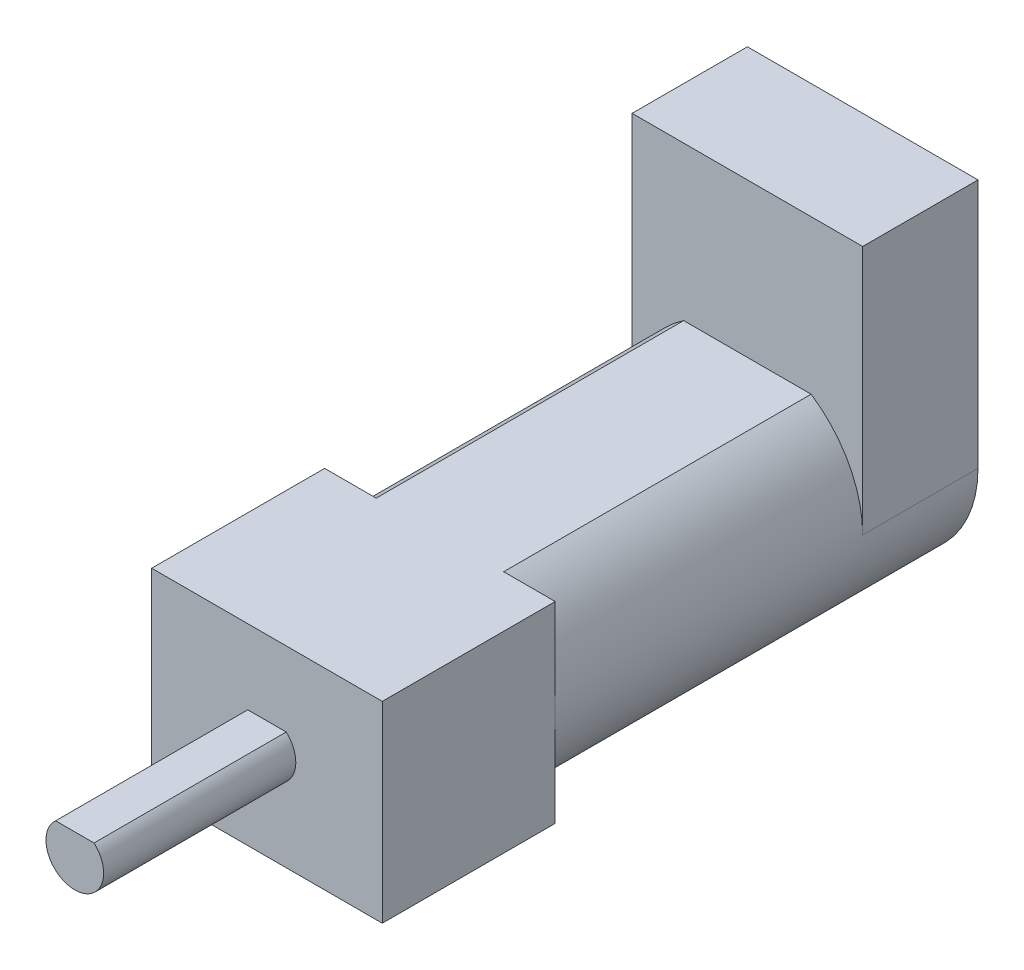
ISO-10303-21;
HEADER;
FILE_DESCRIPTION(('STEP AP214'),'2;1');
FILE_NAME('part.step','',(''),(''),'','','');
FILE_SCHEMA(('AUTOMOTIVE_DESIGN { 1 0 10303 214 1 1 1 1 }'));
ENDSEC;
DATA;
#1=APPLICATION_CONTEXT('core data for automotive mechanical design processes');
#2=APPLICATION_PROTOCOL_DEFINITION('international standard','automotive_design',2000,#1);
#3=PRODUCT_CONTEXT('',#1,'mechanical');
#4=PRODUCT('Part','Part','',(#3));
#5=PRODUCT_RELATED_PRODUCT_CATEGORY('part','',(#4));
#6=PRODUCT_DEFINITION_FORMATION('','',#4);
#7=PRODUCT_DEFINITION_CONTEXT('part definition',#1,'design');
#8=PRODUCT_DEFINITION('design','',#6,#7);
#9=PRODUCT_DEFINITION_SHAPE('','',#8);
#10=(LENGTH_UNIT() NAMED_UNIT(*) SI_UNIT(.MILLI.,.METRE.));
#11=(NAMED_UNIT(*) PLANE_ANGLE_UNIT() SI_UNIT($,.RADIAN.));
#12=(NAMED_UNIT(*) SI_UNIT($,.STERADIAN.) SOLID_ANGLE_UNIT());
#13=UNCERTAINTY_MEASURE_WITH_UNIT(LENGTH_MEASURE(1.E-05),#10,'distance_accuracy_value','');
#14=(GEOMETRIC_REPRESENTATION_CONTEXT(3) GLOBAL_UNCERTAINTY_ASSIGNED_CONTEXT((#13)) GLOBAL_UNIT_ASSIGNED_CONTEXT((#10,
#11,#12)) REPRESENTATION_CONTEXT('',''));
#15=CARTESIAN_POINT('',(0.,0.,0.));
#16=DIRECTION('',(0.,0.,1.));
#17=DIRECTION('',(1.,0.,0.));
#18=AXIS2_PLACEMENT_3D('',#15,#16,#17);
#19=CARTESIAN_POINT('',(0.,0.,0.));
#20=DIRECTION('',(0.,0.,-1.));
#21=DIRECTION('',(-1.,0.,0.));
#22=AXIS2_PLACEMENT_3D('',#19,#20,#21);
#23=PLANE('',#22);
#24=CARTESIAN_POINT('',(0.,0.,0.));
#25=DIRECTION('',(0.,0.,-1.));
#26=DIRECTION('',(-1.,0.,0.));
#27=AXIS2_PLACEMENT_3D('',#24,#25,#26);
#28=CIRCLE('',#27,6.);
#29=CARTESIAN_POINT('',(-3.3166247903554,-5.,0.));
#30=VERTEX_POINT('',#29);
#31=CARTESIAN_POINT('',(-6.,0.,0.));
#32=VERTEX_POINT('',#31);
#33=EDGE_CURVE('E47',#30,#32,#28,.T.);
#34=ORIENTED_EDGE('',*,*,#33,.F.);
#35=DIRECTION('',(1.,0.,0.));
#36=VECTOR('',#35,1.);
#37=CARTESIAN_POINT('',(-6.,-5.,0.));
#38=LINE('',#37,#36);
#39=CARTESIAN_POINT('',(-6.,-5.,0.));
#40=VERTEX_POINT('',#39);
#41=EDGE_CURVE('E234',#40,#30,#38,.T.);
#42=ORIENTED_EDGE('',*,*,#41,.F.);
#43=DIRECTION('',(0.,-1.,0.));
#44=VECTOR('',#43,1.);
#45=CARTESIAN_POINT('',(-6.,-5.,0.));
#46=LINE('',#45,#44);
#47=EDGE_CURVE('E248',#32,#40,#46,.T.);
#48=ORIENTED_EDGE('',*,*,#47,.F.);
#49=EDGE_LOOP('',(#34,#42,#48));
#50=FACE_BOUND('',#49,.T.);
#51=ADVANCED_FACE('F36',(#50),#23,.T.);
#52=CARTESIAN_POINT('',(-3.3166247903554,5.,0.));
#53=VERTEX_POINT('',#52);
#54=EDGE_CURVE('E11',#32,#53,#28,.T.);
#55=ORIENTED_EDGE('',*,*,#54,.F.);
#56=CARTESIAN_POINT('',(-6.,5.,0.));
#57=VERTEX_POINT('',#56);
#58=EDGE_CURVE('E249',#57,#32,#46,.T.);
#59=ORIENTED_EDGE('',*,*,#58,.F.);
#60=DIRECTION('',(-1.,0.,0.));
#61=VECTOR('',#60,1.);
#62=CARTESIAN_POINT('',(-6.,5.,0.));
#63=LINE('',#62,#61);
#64=EDGE_CURVE('E244',#53,#57,#63,.T.);
#65=ORIENTED_EDGE('',*,*,#64,.F.);
#66=EDGE_LOOP('',(#55,#59,#65));
#67=FACE_BOUND('',#66,.T.);
#68=ADVANCED_FACE('F295',(#67),#23,.T.);
#69=CARTESIAN_POINT('',(0.,0.,0.));
#70=DIRECTION('',(0.,0.,-1.));
#71=DIRECTION('',(-1.,0.,0.));
#72=AXIS2_PLACEMENT_3D('',#69,#70,#71);
#73=CIRCLE('',#72,6.);
#74=CARTESIAN_POINT('',(3.3166247903554,5.,0.));
#75=VERTEX_POINT('',#74);
#76=CARTESIAN_POINT('',(6.,0.,0.));
#77=VERTEX_POINT('',#76);
#78=EDGE_CURVE('E201',#75,#77,#73,.T.);
#79=ORIENTED_EDGE('',*,*,#78,.F.);
#80=CARTESIAN_POINT('',(6.,5.,0.));
#81=VERTEX_POINT('',#80);
#82=EDGE_CURVE('E245',#81,#75,#63,.T.);
#83=ORIENTED_EDGE('',*,*,#82,.F.);
#84=DIRECTION('',(0.,1.,0.));
#85=VECTOR('',#84,1.);
#86=CARTESIAN_POINT('',(6.,-5.,0.));
#87=LINE('',#86,#85);
#88=EDGE_CURVE('E229',#77,#81,#87,.T.);
#89=ORIENTED_EDGE('',*,*,#88,.F.);
#90=EDGE_LOOP('',(#79,#83,#89));
#91=FACE_BOUND('',#90,.T.);
#92=ADVANCED_FACE('F274',(#91),#23,.T.);
#93=CARTESIAN_POINT('',(0.,0.,9.));
#94=DIRECTION('',(0.,0.,-1.));
#95=DIRECTION('',(-1.,0.,0.));
#96=AXIS2_PLACEMENT_3D('',#93,#94,#95);
#97=PLANE('',#96);
#98=DIRECTION('',(0.,1.,0.));
#99=VECTOR('',#98,1.);
#100=CARTESIAN_POINT('',(6.,-5.,9.));
#101=LINE('',#100,#99);
#102=CARTESIAN_POINT('',(6.,-5.,9.));
#103=VERTEX_POINT('',#102);
#104=CARTESIAN_POINT('',(6.,5.,9.));
#105=VERTEX_POINT('',#104);
#106=EDGE_CURVE('E230',#103,#105,#101,.T.);
#107=ORIENTED_EDGE('',*,*,#106,.T.);
#108=DIRECTION('',(-1.,0.,0.));
#109=VECTOR('',#108,1.);
#110=CARTESIAN_POINT('',(-6.,5.,9.));
#111=LINE('',#110,#109);
#112=CARTESIAN_POINT('',(-6.,5.,9.));
#113=VERTEX_POINT('',#112);
#114=EDGE_CURVE('E233',#105,#113,#111,.T.);
#115=ORIENTED_EDGE('',*,*,#114,.T.);
#116=DIRECTION('',(0.,-1.,0.));
#117=VECTOR('',#116,1.);
#118=CARTESIAN_POINT('',(-6.,-5.,9.));
#119=LINE('',#118,#117);
#120=CARTESIAN_POINT('',(-6.,-5.,9.));
#121=VERTEX_POINT('',#120);
#122=EDGE_CURVE('E236',#113,#121,#119,.T.);
#123=ORIENTED_EDGE('',*,*,#122,.T.);
#124=DIRECTION('',(1.,0.,0.));
#125=VECTOR('',#124,1.);
#126=CARTESIAN_POINT('',(-6.,-5.,9.));
#127=LINE('',#126,#125);
#128=EDGE_CURVE('E238',#121,#103,#127,.T.);
#129=ORIENTED_EDGE('',*,*,#128,.T.);
#130=EDGE_LOOP('',(#107,#115,#123,#129));
#131=FACE_BOUND('',#130,.T.);
#132=CARTESIAN_POINT('',(0.,0.,9.));
#133=DIRECTION('',(0.,0.,1.));
#134=DIRECTION('',(1.,0.,0.));
#135=AXIS2_PLACEMENT_3D('',#132,#133,#134);
#136=CIRCLE('',#135,1.5);
#137=CARTESIAN_POINT('',(-1.,1.11803398874989,9.));
#138=VERTEX_POINT('',#137);
#139=CARTESIAN_POINT('',(1.,1.11803398874989,9.));
#140=VERTEX_POINT('',#139);
#141=EDGE_CURVE('E208',#138,#140,#136,.T.);
#142=ORIENTED_EDGE('',*,*,#141,.F.);
#143=DIRECTION('',(-1.,0.,0.));
#144=VECTOR('',#143,1.);
#145=CARTESIAN_POINT('',(-1.,1.11803398874989,9.));
#146=LINE('',#145,#144);
#147=EDGE_CURVE('E217',#140,#138,#146,.T.);
#148=ORIENTED_EDGE('',*,*,#147,.F.);
#149=EDGE_LOOP('',(#142,#148));
#150=FACE_BOUND('',#149,.T.);
#151=ADVANCED_FACE('F302',(#131,#150),#97,.F.);
#152=CARTESIAN_POINT('',(6.,-5.,9.));
#153=DIRECTION('',(-1.,0.,0.));
#154=DIRECTION('',(0.,0.,1.));
#155=AXIS2_PLACEMENT_3D('',#152,#153,#154);
#156=PLANE('',#155);
#157=CARTESIAN_POINT('',(6.,-5.,0.));
#158=VERTEX_POINT('',#157);
#159=EDGE_CURVE('E241',#158,#77,#87,.T.);
#160=ORIENTED_EDGE('',*,*,#159,.T.);
#161=ORIENTED_EDGE('',*,*,#88,.T.);
#162=DIRECTION('',(0.,0.,-1.));
#163=VECTOR('',#162,1.);
#164=CARTESIAN_POINT('',(6.,5.,9.));
#165=LINE('',#164,#163);
#166=EDGE_CURVE('E40',#105,#81,#165,.T.);
#167=ORIENTED_EDGE('',*,*,#166,.F.);
#168=ORIENTED_EDGE('',*,*,#106,.F.);
#169=DIRECTION('',(0.,0.,-1.));
#170=VECTOR('',#169,1.);
#171=CARTESIAN_POINT('',(6.,-5.,9.));
#172=LINE('',#171,#170);
#173=EDGE_CURVE('E240',#103,#158,#172,.T.);
#174=ORIENTED_EDGE('',*,*,#173,.T.);
#175=EDGE_LOOP('',(#160,#161,#167,#168,#174));
#176=FACE_BOUND('',#175,.T.);
#177=ADVANCED_FACE('F38',(#176),#156,.F.);
#178=CARTESIAN_POINT('',(-6.,5.,9.));
#179=DIRECTION('',(0.,-1.,0.));
#180=DIRECTION('',(0.,0.,-1.));
#181=AXIS2_PLACEMENT_3D('',#178,#179,#180);
#182=PLANE('',#181);
#183=ORIENTED_EDGE('',*,*,#82,.T.);
#184=DIRECTION('',(0.,0.,1.));
#185=VECTOR('',#184,1.);
#186=CARTESIAN_POINT('',(3.3166247903554,5.,-16.));
#187=LINE('',#186,#185);
#188=CARTESIAN_POINT('',(3.3166247903554,5.,-16.));
#189=VERTEX_POINT('',#188);
#190=EDGE_CURVE('E159',#189,#75,#187,.T.);
#191=ORIENTED_EDGE('',*,*,#190,.F.);
#192=DIRECTION('',(-1.,0.,0.));
#193=VECTOR('',#192,1.);
#194=CARTESIAN_POINT('',(3.3166247903554,5.,-16.));
#195=LINE('',#194,#193);
#196=CARTESIAN_POINT('',(-3.3166247903554,5.,-16.));
#197=VERTEX_POINT('',#196);
#198=EDGE_CURVE('E199',#189,#197,#195,.T.);
#199=ORIENTED_EDGE('',*,*,#198,.T.);
#200=DIRECTION('',(0.,0.,1.));
#201=VECTOR('',#200,1.);
#202=CARTESIAN_POINT('',(-3.3166247903554,5.,-16.));
#203=LINE('',#202,#201);
#204=EDGE_CURVE('E203',#197,#53,#203,.T.);
#205=ORIENTED_EDGE('',*,*,#204,.T.);
#206=ORIENTED_EDGE('',*,*,#64,.T.);
#207=DIRECTION('',(0.,0.,-1.));
#208=VECTOR('',#207,1.);
#209=CARTESIAN_POINT('',(-6.,5.,9.));
#210=LINE('',#209,#208);
#211=EDGE_CURVE('E258',#113,#57,#210,.T.);
#212=ORIENTED_EDGE('',*,*,#211,.F.);
#213=ORIENTED_EDGE('',*,*,#114,.F.);
#214=ORIENTED_EDGE('',*,*,#166,.T.);
#215=EDGE_LOOP('',(#183,#191,#199,#205,#206,#212,#213,#214));
#216=FACE_BOUND('',#215,.T.);
#217=ADVANCED_FACE('F267',(#216),#182,.F.);
#218=CARTESIAN_POINT('',(-6.,-5.,9.));
#219=DIRECTION('',(1.,0.,0.));
#220=DIRECTION('',(0.,0.,-1.));
#221=AXIS2_PLACEMENT_3D('',#218,#219,#220);
#222=PLANE('',#221);
#223=ORIENTED_EDGE('',*,*,#58,.T.);
#224=ORIENTED_EDGE('',*,*,#47,.T.);
#225=DIRECTION('',(0.,0.,-1.));
#226=VECTOR('',#225,1.);
#227=CARTESIAN_POINT('',(-6.,-5.,9.));
#228=LINE('',#227,#226);
#229=EDGE_CURVE('E256',#121,#40,#228,.T.);
#230=ORIENTED_EDGE('',*,*,#229,.F.);
#231=ORIENTED_EDGE('',*,*,#122,.F.);
#232=ORIENTED_EDGE('',*,*,#211,.T.);
#233=EDGE_LOOP('',(#223,#224,#230,#231,#232));
#234=FACE_BOUND('',#233,.T.);
#235=ADVANCED_FACE('F293',(#234),#222,.F.);
#236=CARTESIAN_POINT('',(-6.,-5.,9.));
#237=DIRECTION('',(0.,1.,0.));
#238=DIRECTION('',(0.,0.,1.));
#239=AXIS2_PLACEMENT_3D('',#236,#237,#238);
#240=PLANE('',#239);
#241=ORIENTED_EDGE('',*,*,#41,.T.);
#242=DIRECTION('',(0.,0.,1.));
#243=VECTOR('',#242,1.);
#244=CARTESIAN_POINT('',(-3.3166247903554,-5.,-16.));
#245=LINE('',#244,#243);
#246=CARTESIAN_POINT('',(-3.3166247903554,-5.,-22.));
#247=VERTEX_POINT('',#246);
#248=EDGE_CURVE('E160',#247,#30,#245,.T.);
#249=ORIENTED_EDGE('',*,*,#248,.F.);
#250=DIRECTION('',(-1.,0.,0.));
#251=VECTOR('',#250,1.);
#252=CARTESIAN_POINT('',(3.3166247903554,-5.,-22.));
#253=LINE('',#252,#251);
#254=CARTESIAN_POINT('',(3.3166247903554,-5.,-22.));
#255=VERTEX_POINT('',#254);
#256=EDGE_CURVE('E163',#255,#247,#253,.T.);
#257=ORIENTED_EDGE('',*,*,#256,.F.);
#258=DIRECTION('',(0.,0.,1.));
#259=VECTOR('',#258,1.);
#260=CARTESIAN_POINT('',(3.3166247903554,-5.,-16.));
#261=LINE('',#260,#259);
#262=CARTESIAN_POINT('',(3.3166247903554,-5.,0.));
#263=VERTEX_POINT('',#262);
#264=EDGE_CURVE('E151',#255,#263,#261,.T.);
#265=ORIENTED_EDGE('',*,*,#264,.T.);
#266=EDGE_CURVE('E252',#263,#158,#38,.T.);
#267=ORIENTED_EDGE('',*,*,#266,.T.);
#268=ORIENTED_EDGE('',*,*,#173,.F.);
#269=ORIENTED_EDGE('',*,*,#128,.F.);
#270=ORIENTED_EDGE('',*,*,#229,.T.);
#271=EDGE_LOOP('',(#241,#249,#257,#265,#267,#268,#269,#270));
#272=FACE_BOUND('',#271,.T.);
#273=ADVANCED_FACE('F165',(#272),#240,.F.);
#274=EDGE_CURVE('E45',#77,#263,#73,.T.);
#275=ORIENTED_EDGE('',*,*,#274,.F.);
#276=ORIENTED_EDGE('',*,*,#159,.F.);
#277=ORIENTED_EDGE('',*,*,#266,.F.);
#278=EDGE_LOOP('',(#275,#276,#277));
#279=FACE_BOUND('',#278,.T.);
#280=ADVANCED_FACE('F303',(#279),#23,.T.);
#281=CARTESIAN_POINT('',(0.,0.,19.));
#282=DIRECTION('',(0.,0.,-1.));
#283=DIRECTION('',(-1.,0.,0.));
#284=AXIS2_PLACEMENT_3D('',#281,#282,#283);
#285=CYLINDRICAL_SURFACE('',#284,1.5);
#286=ORIENTED_EDGE('',*,*,#141,.T.);
#287=DIRECTION('',(0.,0.,-1.));
#288=VECTOR('',#287,1.);
#289=CARTESIAN_POINT('',(1.,1.11803398874989,19.));
#290=LINE('',#289,#288);
#291=CARTESIAN_POINT('',(1.,1.11803398874989,19.));
#292=VERTEX_POINT('',#291);
#293=EDGE_CURVE('E226',#292,#140,#290,.T.);
#294=ORIENTED_EDGE('',*,*,#293,.F.);
#295=CARTESIAN_POINT('',(0.,0.,19.));
#296=DIRECTION('',(0.,0.,1.));
#297=DIRECTION('',(1.,0.,0.));
#298=AXIS2_PLACEMENT_3D('',#295,#296,#297);
#299=CIRCLE('',#298,1.5);
#300=CARTESIAN_POINT('',(-1.,1.11803398874989,19.));
#301=VERTEX_POINT('',#300);
#302=EDGE_CURVE('E213',#301,#292,#299,.T.);
#303=ORIENTED_EDGE('',*,*,#302,.F.);
#304=DIRECTION('',(0.,0.,-1.));
#305=VECTOR('',#304,1.);
#306=CARTESIAN_POINT('',(-1.,1.11803398874989,19.));
#307=LINE('',#306,#305);
#308=EDGE_CURVE('E219',#301,#138,#307,.T.);
#309=ORIENTED_EDGE('',*,*,#308,.T.);
#310=EDGE_LOOP('',(#286,#294,#303,#309));
#311=FACE_BOUND('',#310,.T.);
#312=ADVANCED_FACE('F307',(#311),#285,.T.);
#313=CARTESIAN_POINT('',(-1.,1.11803398874989,19.));
#314=DIRECTION('',(0.,-1.,0.));
#315=DIRECTION('',(0.,0.,-1.));
#316=AXIS2_PLACEMENT_3D('',#313,#314,#315);
#317=PLANE('',#316);
#318=ORIENTED_EDGE('',*,*,#147,.T.);
#319=ORIENTED_EDGE('',*,*,#308,.F.);
#320=DIRECTION('',(-1.,0.,0.));
#321=VECTOR('',#320,1.);
#322=CARTESIAN_POINT('',(-1.,1.11803398874989,19.));
#323=LINE('',#322,#321);
#324=EDGE_CURVE('E216',#292,#301,#323,.T.);
#325=ORIENTED_EDGE('',*,*,#324,.F.);
#326=ORIENTED_EDGE('',*,*,#293,.T.);
#327=EDGE_LOOP('',(#318,#319,#325,#326));
#328=FACE_BOUND('',#327,.T.);
#329=ADVANCED_FACE('F328',(#328),#317,.F.);
#330=CARTESIAN_POINT('',(0.,0.,19.));
#331=DIRECTION('',(0.,0.,1.));
#332=DIRECTION('',(1.,0.,0.));
#333=AXIS2_PLACEMENT_3D('',#330,#331,#332);
#334=PLANE('',#333);
#335=ORIENTED_EDGE('',*,*,#302,.T.);
#336=ORIENTED_EDGE('',*,*,#324,.T.);
#337=EDGE_LOOP('',(#335,#336));
#338=FACE_BOUND('',#337,.T.);
#339=ADVANCED_FACE('F331',(#338),#334,.T.);
#340=CARTESIAN_POINT('',(0.,0.,-16.));
#341=DIRECTION('',(0.,0.,1.));
#342=DIRECTION('',(1.,0.,0.));
#343=AXIS2_PLACEMENT_3D('',#340,#341,#342);
#344=CYLINDRICAL_SURFACE('',#343,6.);
#345=ORIENTED_EDGE('',*,*,#78,.T.);
#346=ORIENTED_EDGE('',*,*,#274,.T.);
#347=ORIENTED_EDGE('',*,*,#264,.F.);
#348=CARTESIAN_POINT('',(0.,0.,-22.));
#349=DIRECTION('',(0.,0.,-1.));
#350=DIRECTION('',(-1.,0.,0.));
#351=AXIS2_PLACEMENT_3D('',#348,#349,#350);
#352=CIRCLE('',#351,6.);
#353=CARTESIAN_POINT('',(6.,0.,-22.));
#354=VERTEX_POINT('',#353);
#355=EDGE_CURVE('E157',#354,#255,#352,.T.);
#356=ORIENTED_EDGE('',*,*,#355,.F.);
#357=DIRECTION('',(0.,0.,1.));
#358=VECTOR('',#357,1.);
#359=CARTESIAN_POINT('',(6.,0.,-22.));
#360=LINE('',#359,#358);
#361=CARTESIAN_POINT('',(6.,0.,-16.));
#362=VERTEX_POINT('',#361);
#363=EDGE_CURVE('E186',#354,#362,#360,.T.);
#364=ORIENTED_EDGE('',*,*,#363,.T.);
#365=CARTESIAN_POINT('',(0.,0.,-16.));
#366=DIRECTION('',(0.,0.,-1.));
#367=DIRECTION('',(-1.,0.,0.));
#368=AXIS2_PLACEMENT_3D('',#365,#366,#367);
#369=CIRCLE('',#368,6.);
#370=EDGE_CURVE('E62',#189,#362,#369,.T.);
#371=ORIENTED_EDGE('',*,*,#370,.F.);
#372=ORIENTED_EDGE('',*,*,#190,.T.);
#373=EDGE_LOOP('',(#345,#346,#347,#356,#364,#371,#372));
#374=FACE_BOUND('',#373,.T.);
#375=ADVANCED_FACE('F154',(#374),#344,.T.);
#376=CARTESIAN_POINT('',(0.,0.,-16.));
#377=DIRECTION('',(0.,0.,1.));
#378=DIRECTION('',(1.,0.,0.));
#379=AXIS2_PLACEMENT_3D('',#376,#377,#378);
#380=CYLINDRICAL_SURFACE('',#379,6.);
#381=ORIENTED_EDGE('',*,*,#33,.T.);
#382=ORIENTED_EDGE('',*,*,#54,.T.);
#383=ORIENTED_EDGE('',*,*,#204,.F.);
#384=CARTESIAN_POINT('',(0.,0.,-16.));
#385=DIRECTION('',(0.,0.,-1.));
#386=DIRECTION('',(-1.,0.,0.));
#387=AXIS2_PLACEMENT_3D('',#384,#385,#386);
#388=CIRCLE('',#387,6.);
#389=CARTESIAN_POINT('',(-6.,0.,-16.));
#390=VERTEX_POINT('',#389);
#391=EDGE_CURVE('E54',#390,#197,#388,.T.);
#392=ORIENTED_EDGE('',*,*,#391,.F.);
#393=DIRECTION('',(0.,0.,1.));
#394=VECTOR('',#393,1.);
#395=CARTESIAN_POINT('',(-6.,0.,-22.));
#396=LINE('',#395,#394);
#397=CARTESIAN_POINT('',(-6.,0.,-22.));
#398=VERTEX_POINT('',#397);
#399=EDGE_CURVE('E197',#398,#390,#396,.T.);
#400=ORIENTED_EDGE('',*,*,#399,.F.);
#401=CARTESIAN_POINT('',(0.,0.,-22.));
#402=DIRECTION('',(0.,0.,-1.));
#403=DIRECTION('',(-1.,0.,0.));
#404=AXIS2_PLACEMENT_3D('',#401,#402,#403);
#405=CIRCLE('',#404,6.);
#406=EDGE_CURVE('E169',#247,#398,#405,.T.);
#407=ORIENTED_EDGE('',*,*,#406,.F.);
#408=ORIENTED_EDGE('',*,*,#248,.T.);
#409=EDGE_LOOP('',(#381,#382,#383,#392,#400,#407,#408));
#410=FACE_BOUND('',#409,.T.);
#411=ADVANCED_FACE('F275',(#410),#380,.T.);
#412=CARTESIAN_POINT('',(0.,0.,-16.));
#413=DIRECTION('',(0.,0.,-1.));
#414=DIRECTION('',(-1.,0.,0.));
#415=AXIS2_PLACEMENT_3D('',#412,#413,#414);
#416=PLANE('',#415);
#417=ORIENTED_EDGE('',*,*,#198,.F.);
#418=ORIENTED_EDGE('',*,*,#370,.T.);
#419=DIRECTION('',(0.,-1.,0.));
#420=VECTOR('',#419,1.);
#421=CARTESIAN_POINT('',(6.,0.,-16.));
#422=LINE('',#421,#420);
#423=CARTESIAN_POINT('',(6.,13.,-16.));
#424=VERTEX_POINT('',#423);
#425=EDGE_CURVE('E175',#424,#362,#422,.T.);
#426=ORIENTED_EDGE('',*,*,#425,.F.);
#427=DIRECTION('',(1.,0.,0.));
#428=VECTOR('',#427,1.);
#429=CARTESIAN_POINT('',(6.,13.,-16.));
#430=LINE('',#429,#428);
#431=CARTESIAN_POINT('',(-6.,13.,-16.));
#432=VERTEX_POINT('',#431);
#433=EDGE_CURVE('E177',#432,#424,#430,.T.);
#434=ORIENTED_EDGE('',*,*,#433,.F.);
#435=DIRECTION('',(0.,1.,0.));
#436=VECTOR('',#435,1.);
#437=CARTESIAN_POINT('',(-6.,0.,-16.));
#438=LINE('',#437,#436);
#439=EDGE_CURVE('E187',#390,#432,#438,.T.);
#440=ORIENTED_EDGE('',*,*,#439,.F.);
#441=ORIENTED_EDGE('',*,*,#391,.T.);
#442=EDGE_LOOP('',(#417,#418,#426,#434,#440,#441));
#443=FACE_BOUND('',#442,.T.);
#444=ADVANCED_FACE('F277',(#443),#416,.F.);
#445=CARTESIAN_POINT('',(-6.,0.,-22.));
#446=DIRECTION('',(1.,0.,0.));
#447=DIRECTION('',(0.,1.,0.));
#448=AXIS2_PLACEMENT_3D('',#445,#446,#447);
#449=PLANE('',#448);
#450=ORIENTED_EDGE('',*,*,#439,.T.);
#451=DIRECTION('',(0.,0.,1.));
#452=VECTOR('',#451,1.);
#453=CARTESIAN_POINT('',(-6.,13.,-22.));
#454=LINE('',#453,#452);
#455=CARTESIAN_POINT('',(-6.,13.,-22.));
#456=VERTEX_POINT('',#455);
#457=EDGE_CURVE('E194',#456,#432,#454,.T.);
#458=ORIENTED_EDGE('',*,*,#457,.F.);
#459=DIRECTION('',(0.,1.,0.));
#460=VECTOR('',#459,1.);
#461=CARTESIAN_POINT('',(-6.,0.,-22.));
#462=LINE('',#461,#460);
#463=EDGE_CURVE('E181',#398,#456,#462,.T.);
#464=ORIENTED_EDGE('',*,*,#463,.F.);
#465=ORIENTED_EDGE('',*,*,#399,.T.);
#466=EDGE_LOOP('',(#450,#458,#464,#465));
#467=FACE_BOUND('',#466,.T.);
#468=ADVANCED_FACE('F281',(#467),#449,.F.);
#469=CARTESIAN_POINT('',(6.,13.,-22.));
#470=DIRECTION('',(0.,-1.,0.));
#471=DIRECTION('',(0.,0.,-1.));
#472=AXIS2_PLACEMENT_3D('',#469,#470,#471);
#473=PLANE('',#472);
#474=ORIENTED_EDGE('',*,*,#433,.T.);
#475=DIRECTION('',(0.,0.,1.));
#476=VECTOR('',#475,1.);
#477=CARTESIAN_POINT('',(6.,13.,-22.));
#478=LINE('',#477,#476);
#479=CARTESIAN_POINT('',(6.,13.,-22.));
#480=VERTEX_POINT('',#479);
#481=EDGE_CURVE('E191',#480,#424,#478,.T.);
#482=ORIENTED_EDGE('',*,*,#481,.F.);
#483=DIRECTION('',(1.,0.,0.));
#484=VECTOR('',#483,1.);
#485=CARTESIAN_POINT('',(6.,13.,-22.));
#486=LINE('',#485,#484);
#487=EDGE_CURVE('E183',#456,#480,#486,.T.);
#488=ORIENTED_EDGE('',*,*,#487,.F.);
#489=ORIENTED_EDGE('',*,*,#457,.T.);
#490=EDGE_LOOP('',(#474,#482,#488,#489));
#491=FACE_BOUND('',#490,.T.);
#492=ADVANCED_FACE('F285',(#491),#473,.F.);
#493=CARTESIAN_POINT('',(6.,0.,-22.));
#494=DIRECTION('',(-1.,0.,0.));
#495=DIRECTION('',(0.,0.,1.));
#496=AXIS2_PLACEMENT_3D('',#493,#494,#495);
#497=PLANE('',#496);
#498=ORIENTED_EDGE('',*,*,#425,.T.);
#499=ORIENTED_EDGE('',*,*,#363,.F.);
#500=DIRECTION('',(0.,-1.,0.));
#501=VECTOR('',#500,1.);
#502=CARTESIAN_POINT('',(6.,0.,-22.));
#503=LINE('',#502,#501);
#504=EDGE_CURVE('E173',#480,#354,#503,.T.);
#505=ORIENTED_EDGE('',*,*,#504,.F.);
#506=ORIENTED_EDGE('',*,*,#481,.T.);
#507=EDGE_LOOP('',(#498,#499,#505,#506));
#508=FACE_BOUND('',#507,.T.);
#509=ADVANCED_FACE('F438',(#508),#497,.F.);
#510=CARTESIAN_POINT('',(0.,0.,-22.));
#511=DIRECTION('',(0.,0.,-1.));
#512=DIRECTION('',(-1.,0.,0.));
#513=AXIS2_PLACEMENT_3D('',#510,#511,#512);
#514=PLANE('',#513);
#515=ORIENTED_EDGE('',*,*,#355,.T.);
#516=ORIENTED_EDGE('',*,*,#256,.T.);
#517=ORIENTED_EDGE('',*,*,#406,.T.);
#518=ORIENTED_EDGE('',*,*,#463,.T.);
#519=ORIENTED_EDGE('',*,*,#487,.T.);
#520=ORIENTED_EDGE('',*,*,#504,.T.);
#521=EDGE_LOOP('',(#515,#516,#517,#518,#519,#520));
#522=FACE_BOUND('',#521,.T.);
#523=ADVANCED_FACE('F171',(#522),#514,.T.);
#524=CLOSED_SHELL('',(#51,#68,#92,#151,#177,#217,#235,#273,#280,#312,#329,#339,#375,#411,#444,
#468,#492,#509,#523));
#525=MANIFOLD_SOLID_BREP('B2',#524);
#526=ADVANCED_BREP_SHAPE_REPRESENTATION('',(#18,#525),#14);
#527=SHAPE_DEFINITION_REPRESENTATION(#9,#526);
ENDSEC;
END-ISO-10303-21;
